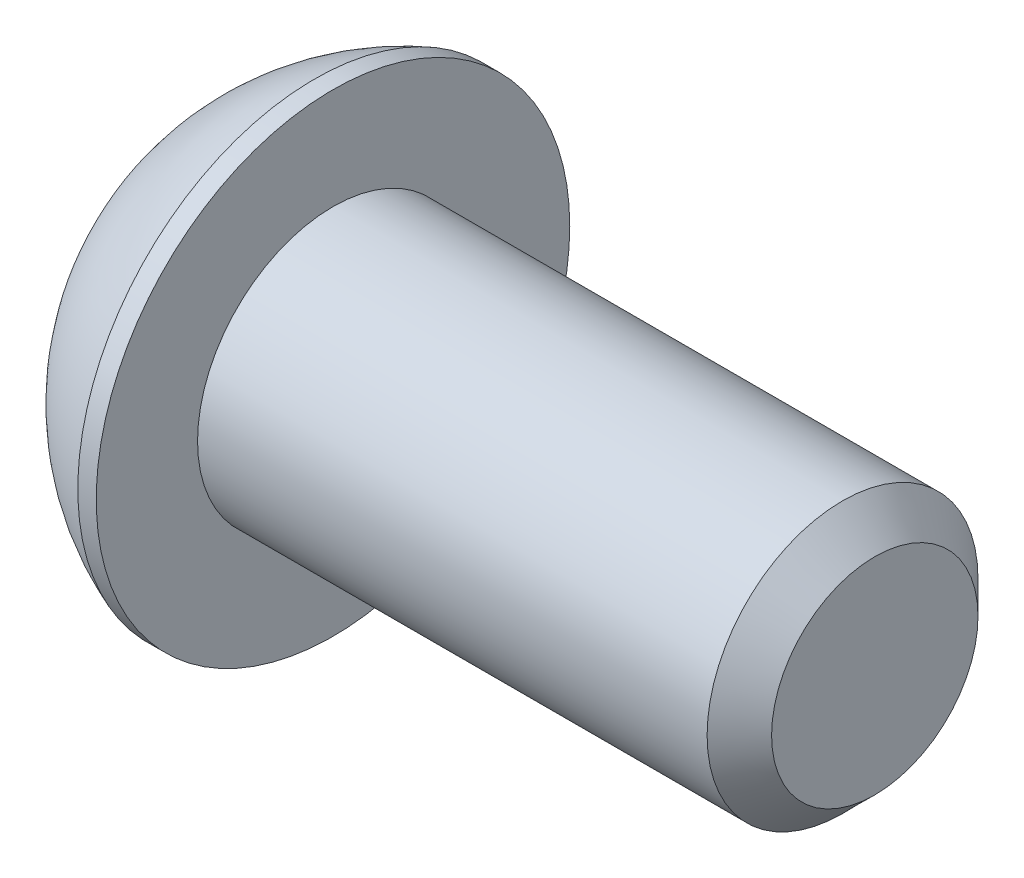
ISO-10303-21;
HEADER;
FILE_DESCRIPTION(('STEP AP214'),'2;1');
FILE_NAME('part.step','',(''),(''),'','','');
FILE_SCHEMA(('AUTOMOTIVE_DESIGN { 1 0 10303 214 1 1 1 1 }'));
ENDSEC;
DATA;
#1=APPLICATION_CONTEXT('core data for automotive mechanical design processes');
#2=APPLICATION_PROTOCOL_DEFINITION('international standard','automotive_design',2000,#1);
#3=PRODUCT_CONTEXT('',#1,'mechanical');
#4=PRODUCT('Part','Part','',(#3));
#5=PRODUCT_RELATED_PRODUCT_CATEGORY('part','',(#4));
#6=PRODUCT_DEFINITION_FORMATION('','',#4);
#7=PRODUCT_DEFINITION_CONTEXT('part definition',#1,'design');
#8=PRODUCT_DEFINITION('design','',#6,#7);
#9=PRODUCT_DEFINITION_SHAPE('','',#8);
#10=(LENGTH_UNIT() NAMED_UNIT(*) SI_UNIT(.MILLI.,.METRE.));
#11=(NAMED_UNIT(*) PLANE_ANGLE_UNIT() SI_UNIT($,.RADIAN.));
#12=(NAMED_UNIT(*) SI_UNIT($,.STERADIAN.) SOLID_ANGLE_UNIT());
#13=UNCERTAINTY_MEASURE_WITH_UNIT(LENGTH_MEASURE(1.E-05),#10,'distance_accuracy_value','');
#14=(GEOMETRIC_REPRESENTATION_CONTEXT(3) GLOBAL_UNCERTAINTY_ASSIGNED_CONTEXT((#13)) GLOBAL_UNIT_ASSIGNED_CONTEXT((#10,
#11,#12)) REPRESENTATION_CONTEXT('',''));
#15=CARTESIAN_POINT('',(0.,0.,0.));
#16=DIRECTION('',(0.,0.,1.));
#17=DIRECTION('',(1.,0.,0.));
#18=AXIS2_PLACEMENT_3D('',#15,#16,#17);
#19=CARTESIAN_POINT('',(1.64730562793069,0.,0.));
#20=DIRECTION('',(1.,0.,0.));
#21=DIRECTION('',(0.,0.,-1.));
#22=AXIS2_PLACEMENT_3D('',#19,#20,#21);
#23=DEGENERATE_TOROIDAL_SURFACE('',#22,0.00892436136860583,5.91819999999996,.T.);
#24=CARTESIAN_POINT('',(-3.3528,0.,0.));
#25=DIRECTION('',(1.,0.,0.));
#26=DIRECTION('',(0.,0.,-1.));
#27=AXIS2_PLACEMENT_3D('',#24,#25,#26);
#28=CIRCLE('',#27,3.17500000000002);
#29=CARTESIAN_POINT('',(-3.3528,0.,-3.17500000000002));
#30=VERTEX_POINT('',#29);
#31=EDGE_CURVE('E150',#30,#30,#28,.T.);
#32=ORIENTED_EDGE('',*,*,#31,.T.);
#33=EDGE_LOOP('',(#32));
#34=FACE_BOUND('',#33,.T.);
#35=CARTESIAN_POINT('',(-0.4318,0.,0.));
#36=DIRECTION('',(1.,0.,0.));
#37=DIRECTION('',(0.,0.,-1.));
#38=AXIS2_PLACEMENT_3D('',#35,#36,#37);
#39=CIRCLE('',#38,5.5499);
#40=CARTESIAN_POINT('',(-0.4318,0.,-5.5499));
#41=VERTEX_POINT('',#40);
#42=EDGE_CURVE('E144',#41,#41,#39,.T.);
#43=ORIENTED_EDGE('',*,*,#42,.F.);
#44=EDGE_LOOP('',(#43));
#45=FACE_BOUND('',#44,.T.);
#46=ADVANCED_FACE('F34',(#34,#45),#23,.T.);
#47=CARTESIAN_POINT('',(-3.3528,3.17500000000002,0.));
#48=DIRECTION('',(-1.,0.,0.));
#49=DIRECTION('',(0.,0.,1.));
#50=AXIS2_PLACEMENT_3D('',#47,#48,#49);
#51=PLANE('',#50);
#52=DIRECTION('',(0.,0.866025403784439,0.5));
#53=VECTOR('',#52,1.);
#54=CARTESIAN_POINT('',(-3.3528,-1.984375,1.14567944042316));
#55=LINE('',#54,#53);
#56=CARTESIAN_POINT('',(-3.3528,-1.984375,1.14567944042316));
#57=VERTEX_POINT('',#56);
#58=CARTESIAN_POINT('',(-3.3528,0.,2.29135888084633));
#59=VERTEX_POINT('',#58);
#60=EDGE_CURVE('E49',#57,#59,#55,.T.);
#61=ORIENTED_EDGE('',*,*,#60,.F.);
#62=DIRECTION('',(0.,0.,1.));
#63=VECTOR('',#62,1.);
#64=CARTESIAN_POINT('',(-3.3528,-1.984375,-1.14567944042316));
#65=LINE('',#64,#63);
#66=CARTESIAN_POINT('',(-3.3528,-1.984375,-1.14567944042316));
#67=VERTEX_POINT('',#66);
#68=EDGE_CURVE('E132',#67,#57,#65,.T.);
#69=ORIENTED_EDGE('',*,*,#68,.F.);
#70=DIRECTION('',(0.,-0.866025403784439,0.5));
#71=VECTOR('',#70,1.);
#72=CARTESIAN_POINT('',(-3.3528,0.,-2.29135888084633));
#73=LINE('',#72,#71);
#74=CARTESIAN_POINT('',(-3.3528,0.,-2.29135888084633));
#75=VERTEX_POINT('',#74);
#76=EDGE_CURVE('E130',#75,#67,#73,.T.);
#77=ORIENTED_EDGE('',*,*,#76,.F.);
#78=DIRECTION('',(0.,-0.866025403784439,-0.5));
#79=VECTOR('',#78,1.);
#80=CARTESIAN_POINT('',(-3.3528,1.984375,-1.14567944042316));
#81=LINE('',#80,#79);
#82=CARTESIAN_POINT('',(-3.3528,1.984375,-1.14567944042316));
#83=VERTEX_POINT('',#82);
#84=EDGE_CURVE('E97',#83,#75,#81,.T.);
#85=ORIENTED_EDGE('',*,*,#84,.F.);
#86=DIRECTION('',(0.,0.,-1.));
#87=VECTOR('',#86,1.);
#88=CARTESIAN_POINT('',(-3.3528,1.984375,1.14567944042316));
#89=LINE('',#88,#87);
#90=CARTESIAN_POINT('',(-3.3528,1.984375,1.14567944042316));
#91=VERTEX_POINT('',#90);
#92=EDGE_CURVE('E126',#91,#83,#89,.T.);
#93=ORIENTED_EDGE('',*,*,#92,.F.);
#94=DIRECTION('',(0.,0.866025403784439,-0.5));
#95=VECTOR('',#94,1.);
#96=CARTESIAN_POINT('',(-3.3528,0.,2.29135888084633));
#97=LINE('',#96,#95);
#98=EDGE_CURVE('E123',#59,#91,#97,.T.);
#99=ORIENTED_EDGE('',*,*,#98,.F.);
#100=EDGE_LOOP('',(#61,#69,#77,#85,#93,#99));
#101=FACE_BOUND('',#100,.T.);
#102=ORIENTED_EDGE('',*,*,#31,.F.);
#103=EDGE_LOOP('',(#102));
#104=FACE_BOUND('',#103,.T.);
#105=ADVANCED_FACE('F166',(#101,#104),#51,.T.);
#106=CARTESIAN_POINT('',(0.,0.,0.));
#107=DIRECTION('',(1.,0.,0.));
#108=DIRECTION('',(0.,0.,-1.));
#109=AXIS2_PLACEMENT_3D('',#106,#107,#108);
#110=PLANE('',#109);
#111=CARTESIAN_POINT('',(0.,0.,0.));
#112=DIRECTION('',(1.,0.,0.));
#113=DIRECTION('',(0.,0.,-1.));
#114=AXIS2_PLACEMENT_3D('',#111,#112,#113);
#115=CIRCLE('',#114,3.175);
#116=CARTESIAN_POINT('',(0.,0.,-3.175));
#117=VERTEX_POINT('',#116);
#118=EDGE_CURVE('E136',#117,#117,#115,.T.);
#119=ORIENTED_EDGE('',*,*,#118,.F.);
#120=EDGE_LOOP('',(#119));
#121=FACE_BOUND('',#120,.T.);
#122=CARTESIAN_POINT('',(0.,0.,0.));
#123=DIRECTION('',(1.,0.,0.));
#124=DIRECTION('',(0.,0.,-1.));
#125=AXIS2_PLACEMENT_3D('',#122,#123,#124);
#126=CIRCLE('',#125,5.5499);
#127=CARTESIAN_POINT('',(0.,0.,-5.5499));
#128=VERTEX_POINT('',#127);
#129=EDGE_CURVE('E147',#128,#128,#126,.T.);
#130=ORIENTED_EDGE('',*,*,#129,.T.);
#131=EDGE_LOOP('',(#130));
#132=FACE_BOUND('',#131,.T.);
#133=ADVANCED_FACE('F171',(#121,#132),#110,.T.);
#134=CARTESIAN_POINT('',(-3.3528,0.,0.));
#135=DIRECTION('',(1.,0.,0.));
#136=DIRECTION('',(0.,0.,-1.));
#137=AXIS2_PLACEMENT_3D('',#134,#135,#136);
#138=CYLINDRICAL_SURFACE('',#137,5.5499);
#139=ORIENTED_EDGE('',*,*,#42,.T.);
#140=EDGE_LOOP('',(#139));
#141=FACE_BOUND('',#140,.T.);
#142=ORIENTED_EDGE('',*,*,#129,.F.);
#143=EDGE_LOOP('',(#142));
#144=FACE_BOUND('',#143,.T.);
#145=ADVANCED_FACE('F178',(#141,#144),#138,.T.);
#146=CARTESIAN_POINT('',(12.7,0.,0.));
#147=DIRECTION('',(-1.,0.,0.));
#148=DIRECTION('',(0.,0.,1.));
#149=AXIS2_PLACEMENT_3D('',#146,#147,#148);
#150=CYLINDRICAL_SURFACE('',#149,3.175);
#151=CARTESIAN_POINT('',(11.9443499999865,0.,0.));
#152=DIRECTION('',(1.,0.,0.));
#153=DIRECTION('',(0.,0.,-1.));
#154=AXIS2_PLACEMENT_3D('',#151,#152,#153);
#155=CIRCLE('',#154,3.175);
#156=CARTESIAN_POINT('',(11.9443499999865,0.,-3.175));
#157=VERTEX_POINT('',#156);
#158=EDGE_CURVE('E11',#157,#157,#155,.F.);
#159=ORIENTED_EDGE('',*,*,#158,.T.);
#160=EDGE_LOOP('',(#159));
#161=FACE_BOUND('',#160,.T.);
#162=ORIENTED_EDGE('',*,*,#118,.T.);
#163=EDGE_LOOP('',(#162));
#164=FACE_BOUND('',#163,.T.);
#165=ADVANCED_FACE('F182',(#161,#164),#150,.T.);
#166=CARTESIAN_POINT('',(12.7,0.,0.));
#167=DIRECTION('',(1.,0.,0.));
#168=DIRECTION('',(0.,0.,-1.));
#169=AXIS2_PLACEMENT_3D('',#166,#167,#168);
#170=PLANE('',#169);
#171=CARTESIAN_POINT('',(12.7,0.,0.));
#172=DIRECTION('',(1.,0.,0.));
#173=DIRECTION('',(0.,0.,-1.));
#174=AXIS2_PLACEMENT_3D('',#171,#172,#173);
#175=CIRCLE('',#174,2.41934999998651);
#176=CARTESIAN_POINT('',(12.7,0.,-2.41934999998651));
#177=VERTEX_POINT('',#176);
#178=EDGE_CURVE('E42',#177,#177,#175,.T.);
#179=ORIENTED_EDGE('',*,*,#178,.T.);
#180=EDGE_LOOP('',(#179));
#181=FACE_BOUND('',#180,.T.);
#182=ADVANCED_FACE('F155',(#181),#170,.T.);
#183=CARTESIAN_POINT('',(-1.1303,-1.984375,1.14567944042316));
#184=DIRECTION('',(0.,-0.5,0.866025403784439));
#185=DIRECTION('',(0.,-0.866025403784439,-0.5));
#186=AXIS2_PLACEMENT_3D('',#183,#184,#185);
#187=PLANE('',#186);
#188=ORIENTED_EDGE('',*,*,#60,.T.);
#189=DIRECTION('',(-1.,0.,0.));
#190=VECTOR('',#189,1.);
#191=CARTESIAN_POINT('',(-1.1303,0.,2.29135888084633));
#192=LINE('',#191,#190);
#193=CARTESIAN_POINT('',(-1.1303,0.,2.29135888084633));
#194=VERTEX_POINT('',#193);
#195=EDGE_CURVE('E79',#194,#59,#192,.T.);
#196=ORIENTED_EDGE('',*,*,#195,.F.);
#197=DIRECTION('',(0.,0.866025403784439,0.5));
#198=VECTOR('',#197,1.);
#199=CARTESIAN_POINT('',(-1.1303,-1.984375,1.14567944042316));
#200=LINE('',#199,#198);
#201=CARTESIAN_POINT('',(-1.1303,-1.984375,1.14567944042316));
#202=VERTEX_POINT('',#201);
#203=EDGE_CURVE('E134',#202,#194,#200,.T.);
#204=ORIENTED_EDGE('',*,*,#203,.F.);
#205=DIRECTION('',(-1.,0.,0.));
#206=VECTOR('',#205,1.);
#207=CARTESIAN_POINT('',(-1.1303,-1.984375,1.14567944042316));
#208=LINE('',#207,#206);
#209=EDGE_CURVE('E57',#202,#57,#208,.T.);
#210=ORIENTED_EDGE('',*,*,#209,.T.);
#211=EDGE_LOOP('',(#188,#196,#204,#210));
#212=FACE_BOUND('',#211,.T.);
#213=ADVANCED_FACE('F189',(#212),#187,.F.);
#214=CARTESIAN_POINT('',(-1.1303,-1.984375,-1.14567944042316));
#215=DIRECTION('',(0.,-1.,0.));
#216=DIRECTION('',(0.,0.,-1.));
#217=AXIS2_PLACEMENT_3D('',#214,#215,#216);
#218=PLANE('',#217);
#219=ORIENTED_EDGE('',*,*,#68,.T.);
#220=ORIENTED_EDGE('',*,*,#209,.F.);
#221=DIRECTION('',(0.,0.,1.));
#222=VECTOR('',#221,1.);
#223=CARTESIAN_POINT('',(-1.1303,-1.984375,-1.14567944042316));
#224=LINE('',#223,#222);
#225=CARTESIAN_POINT('',(-1.1303,-1.984375,-1.14567944042316));
#226=VERTEX_POINT('',#225);
#227=EDGE_CURVE('E109',#226,#202,#224,.T.);
#228=ORIENTED_EDGE('',*,*,#227,.F.);
#229=DIRECTION('',(-1.,0.,0.));
#230=VECTOR('',#229,1.);
#231=CARTESIAN_POINT('',(-1.1303,-1.984375,-1.14567944042316));
#232=LINE('',#231,#230);
#233=EDGE_CURVE('E101',#226,#67,#232,.T.);
#234=ORIENTED_EDGE('',*,*,#233,.T.);
#235=EDGE_LOOP('',(#219,#220,#228,#234));
#236=FACE_BOUND('',#235,.T.);
#237=ADVANCED_FACE('F192',(#236),#218,.F.);
#238=CARTESIAN_POINT('',(-1.1303,0.,-2.29135888084633));
#239=DIRECTION('',(0.,-0.5,-0.866025403784439));
#240=DIRECTION('',(0.,0.866025403784439,-0.5));
#241=AXIS2_PLACEMENT_3D('',#238,#239,#240);
#242=PLANE('',#241);
#243=ORIENTED_EDGE('',*,*,#76,.T.);
#244=ORIENTED_EDGE('',*,*,#233,.F.);
#245=DIRECTION('',(0.,-0.866025403784439,0.5));
#246=VECTOR('',#245,1.);
#247=CARTESIAN_POINT('',(-1.1303,0.,-2.29135888084633));
#248=LINE('',#247,#246);
#249=CARTESIAN_POINT('',(-1.1303,0.,-2.29135888084633));
#250=VERTEX_POINT('',#249);
#251=EDGE_CURVE('E105',#250,#226,#248,.T.);
#252=ORIENTED_EDGE('',*,*,#251,.F.);
#253=DIRECTION('',(-1.,0.,0.));
#254=VECTOR('',#253,1.);
#255=CARTESIAN_POINT('',(-1.1303,0.,-2.29135888084633));
#256=LINE('',#255,#254);
#257=EDGE_CURVE('E90',#250,#75,#256,.T.);
#258=ORIENTED_EDGE('',*,*,#257,.T.);
#259=EDGE_LOOP('',(#243,#244,#252,#258));
#260=FACE_BOUND('',#259,.T.);
#261=ADVANCED_FACE('F106',(#260),#242,.F.);
#262=CARTESIAN_POINT('',(-1.1303,1.984375,-1.14567944042316));
#263=DIRECTION('',(0.,0.5,-0.866025403784439));
#264=DIRECTION('',(0.,0.866025403784439,0.5));
#265=AXIS2_PLACEMENT_3D('',#262,#263,#264);
#266=PLANE('',#265);
#267=ORIENTED_EDGE('',*,*,#84,.T.);
#268=ORIENTED_EDGE('',*,*,#257,.F.);
#269=DIRECTION('',(0.,-0.866025403784439,-0.5));
#270=VECTOR('',#269,1.);
#271=CARTESIAN_POINT('',(-1.1303,1.984375,-1.14567944042316));
#272=LINE('',#271,#270);
#273=CARTESIAN_POINT('',(-1.1303,1.984375,-1.14567944042316));
#274=VERTEX_POINT('',#273);
#275=EDGE_CURVE('E94',#274,#250,#272,.T.);
#276=ORIENTED_EDGE('',*,*,#275,.F.);
#277=DIRECTION('',(-1.,0.,0.));
#278=VECTOR('',#277,1.);
#279=CARTESIAN_POINT('',(-1.1303,1.984375,-1.14567944042316));
#280=LINE('',#279,#278);
#281=EDGE_CURVE('E102',#274,#83,#280,.T.);
#282=ORIENTED_EDGE('',*,*,#281,.T.);
#283=EDGE_LOOP('',(#267,#268,#276,#282));
#284=FACE_BOUND('',#283,.T.);
#285=ADVANCED_FACE('F92',(#284),#266,.F.);
#286=CARTESIAN_POINT('',(-1.1303,1.984375,1.14567944042316));
#287=DIRECTION('',(0.,1.,0.));
#288=DIRECTION('',(0.,0.,1.));
#289=AXIS2_PLACEMENT_3D('',#286,#287,#288);
#290=PLANE('',#289);
#291=ORIENTED_EDGE('',*,*,#92,.T.);
#292=ORIENTED_EDGE('',*,*,#281,.F.);
#293=DIRECTION('',(0.,0.,-1.));
#294=VECTOR('',#293,1.);
#295=CARTESIAN_POINT('',(-1.1303,1.984375,1.14567944042316));
#296=LINE('',#295,#294);
#297=CARTESIAN_POINT('',(-1.1303,1.984375,1.14567944042316));
#298=VERTEX_POINT('',#297);
#299=EDGE_CURVE('E115',#298,#274,#296,.T.);
#300=ORIENTED_EDGE('',*,*,#299,.F.);
#301=DIRECTION('',(-1.,0.,0.));
#302=VECTOR('',#301,1.);
#303=CARTESIAN_POINT('',(-1.1303,1.984375,1.14567944042316));
#304=LINE('',#303,#302);
#305=EDGE_CURVE('E139',#298,#91,#304,.T.);
#306=ORIENTED_EDGE('',*,*,#305,.T.);
#307=EDGE_LOOP('',(#291,#292,#300,#306));
#308=FACE_BOUND('',#307,.T.);
#309=ADVANCED_FACE('F195',(#308),#290,.F.);
#310=CARTESIAN_POINT('',(-1.1303,0.,2.29135888084633));
#311=DIRECTION('',(0.,0.5,0.866025403784439));
#312=DIRECTION('',(0.,-0.866025403784439,0.5));
#313=AXIS2_PLACEMENT_3D('',#310,#311,#312);
#314=PLANE('',#313);
#315=ORIENTED_EDGE('',*,*,#98,.T.);
#316=ORIENTED_EDGE('',*,*,#305,.F.);
#317=DIRECTION('',(0.,0.866025403784439,-0.5));
#318=VECTOR('',#317,1.);
#319=CARTESIAN_POINT('',(-1.1303,0.,2.29135888084633));
#320=LINE('',#319,#318);
#321=EDGE_CURVE('E117',#194,#298,#320,.T.);
#322=ORIENTED_EDGE('',*,*,#321,.F.);
#323=ORIENTED_EDGE('',*,*,#195,.T.);
#324=EDGE_LOOP('',(#315,#316,#322,#323));
#325=FACE_BOUND('',#324,.T.);
#326=ADVANCED_FACE('F162',(#325),#314,.F.);
#327=CARTESIAN_POINT('',(-1.1303,0.,0.));
#328=DIRECTION('',(-1.,0.,0.));
#329=DIRECTION('',(0.,0.,1.));
#330=AXIS2_PLACEMENT_3D('',#327,#328,#329);
#331=PLANE('',#330);
#332=ORIENTED_EDGE('',*,*,#203,.T.);
#333=ORIENTED_EDGE('',*,*,#321,.T.);
#334=ORIENTED_EDGE('',*,*,#299,.T.);
#335=ORIENTED_EDGE('',*,*,#275,.T.);
#336=ORIENTED_EDGE('',*,*,#251,.T.);
#337=ORIENTED_EDGE('',*,*,#227,.T.);
#338=EDGE_LOOP('',(#332,#333,#334,#335,#336,#337));
#339=FACE_BOUND('',#338,.T.);
#340=ADVANCED_FACE('F112',(#339),#331,.T.);
#341=CARTESIAN_POINT('',(12.7,0.,0.));
#342=DIRECTION('',(-1.,0.,0.));
#343=DIRECTION('',(0.,0.,1.));
#344=AXIS2_PLACEMENT_3D('',#341,#342,#343);
#345=CONICAL_SURFACE('',#344,2.41934999998651,0.785398163397446);
#346=ORIENTED_EDGE('',*,*,#158,.F.);
#347=EDGE_LOOP('',(#346));
#348=FACE_BOUND('',#347,.T.);
#349=ORIENTED_EDGE('',*,*,#178,.F.);
#350=EDGE_LOOP('',(#349));
#351=FACE_BOUND('',#350,.T.);
#352=ADVANCED_FACE('F36',(#348,#351),#345,.T.);
#353=CLOSED_SHELL('',(#46,#105,#133,#145,#165,#182,#213,#237,#261,#285,#309,#326,#340,#352));
#354=MANIFOLD_SOLID_BREP('B2',#353);
#355=ADVANCED_BREP_SHAPE_REPRESENTATION('',(#18,#354),#14);
#356=SHAPE_DEFINITION_REPRESENTATION(#9,#355);
ENDSEC;
END-ISO-10303-21;
